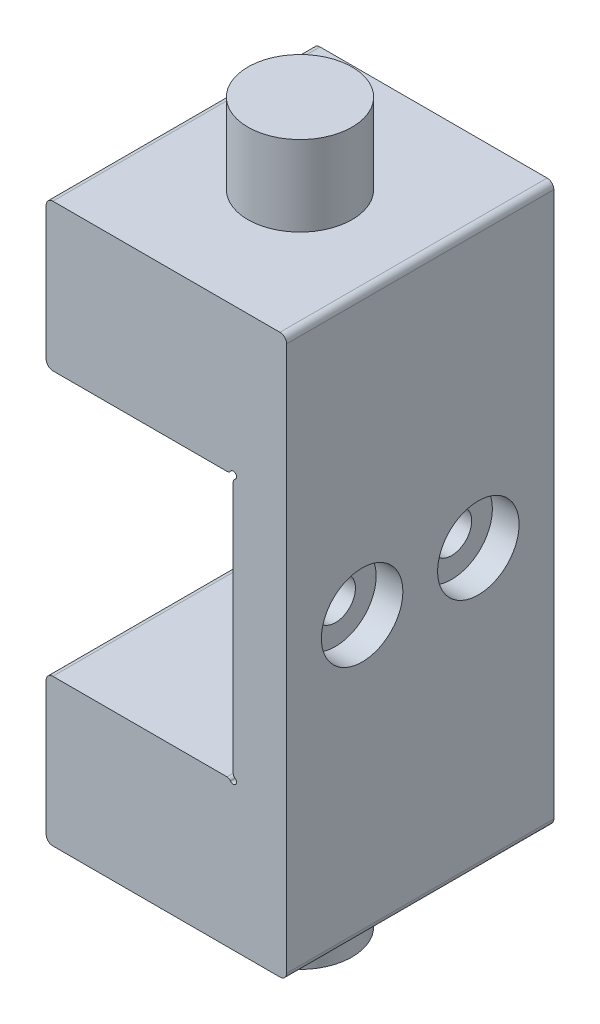
ISO-10303-21;
HEADER;
FILE_DESCRIPTION(('STEP AP214'),'2;1');
FILE_NAME('part.step','',(''),(''),'','','');
FILE_SCHEMA(('AUTOMOTIVE_DESIGN { 1 0 10303 214 1 1 1 1 }'));
ENDSEC;
DATA;
#1=APPLICATION_CONTEXT('core data for automotive mechanical design processes');
#2=APPLICATION_PROTOCOL_DEFINITION('international standard','automotive_design',2000,#1);
#3=PRODUCT_CONTEXT('',#1,'mechanical');
#4=PRODUCT('Part','Part','',(#3));
#5=PRODUCT_RELATED_PRODUCT_CATEGORY('part','',(#4));
#6=PRODUCT_DEFINITION_FORMATION('','',#4);
#7=PRODUCT_DEFINITION_CONTEXT('part definition',#1,'design');
#8=PRODUCT_DEFINITION('design','',#6,#7);
#9=PRODUCT_DEFINITION_SHAPE('','',#8);
#10=(LENGTH_UNIT() NAMED_UNIT(*) SI_UNIT(.MILLI.,.METRE.));
#11=(NAMED_UNIT(*) PLANE_ANGLE_UNIT() SI_UNIT($,.RADIAN.));
#12=(NAMED_UNIT(*) SI_UNIT($,.STERADIAN.) SOLID_ANGLE_UNIT());
#13=UNCERTAINTY_MEASURE_WITH_UNIT(LENGTH_MEASURE(1.E-05),#10,'distance_accuracy_value','');
#14=(GEOMETRIC_REPRESENTATION_CONTEXT(3) GLOBAL_UNCERTAINTY_ASSIGNED_CONTEXT((#13)) GLOBAL_UNIT_ASSIGNED_CONTEXT((#10,
#11,#12)) REPRESENTATION_CONTEXT('',''));
#15=CARTESIAN_POINT('',(0.,0.,0.));
#16=DIRECTION('',(0.,0.,1.));
#17=DIRECTION('',(1.,0.,0.));
#18=AXIS2_PLACEMENT_3D('',#15,#16,#17);
#19=CARTESIAN_POINT('',(-14.001,9.9,14.35));
#20=DIRECTION('',(1.,0.,0.));
#21=DIRECTION('',(0.,1.,0.));
#22=AXIS2_PLACEMENT_3D('',#19,#20,#21);
#23=CYLINDRICAL_SURFACE('',#22,1.5);
#24=CARTESIAN_POINT('',(0.,9.9,14.35));
#25=DIRECTION('',(1.,0.,0.));
#26=DIRECTION('',(0.,1.,0.));
#27=AXIS2_PLACEMENT_3D('',#24,#25,#26);
#28=CIRCLE('',#27,1.5);
#29=CARTESIAN_POINT('',(0.,11.4,14.35));
#30=VERTEX_POINT('',#29);
#31=EDGE_CURVE('E311',#30,#30,#28,.F.);
#32=ORIENTED_EDGE('',*,*,#31,.T.);
#33=EDGE_LOOP('',(#32));
#34=FACE_BOUND('',#33,.T.);
#35=CARTESIAN_POINT('',(2.,9.9,14.35));
#36=DIRECTION('',(1.,0.,0.));
#37=DIRECTION('',(0.,1.,0.));
#38=AXIS2_PLACEMENT_3D('',#35,#36,#37);
#39=CIRCLE('',#38,1.5);
#40=CARTESIAN_POINT('',(2.,11.4,14.35));
#41=VERTEX_POINT('',#40);
#42=EDGE_CURVE('E36',#41,#41,#39,.F.);
#43=ORIENTED_EDGE('',*,*,#42,.F.);
#44=EDGE_LOOP('',(#43));
#45=FACE_BOUND('',#44,.T.);
#46=ADVANCED_FACE('F32',(#34,#45),#23,.F.);
#47=CARTESIAN_POINT('',(-14.001,9.9,5.65));
#48=DIRECTION('',(1.,0.,0.));
#49=DIRECTION('',(0.,1.,0.));
#50=AXIS2_PLACEMENT_3D('',#47,#48,#49);
#51=CYLINDRICAL_SURFACE('',#50,1.5);
#52=CARTESIAN_POINT('',(0.,9.9,5.65));
#53=DIRECTION('',(1.,0.,0.));
#54=DIRECTION('',(0.,1.,0.));
#55=AXIS2_PLACEMENT_3D('',#52,#53,#54);
#56=CIRCLE('',#55,1.5);
#57=CARTESIAN_POINT('',(0.,11.4,5.65));
#58=VERTEX_POINT('',#57);
#59=EDGE_CURVE('E314',#58,#58,#56,.F.);
#60=ORIENTED_EDGE('',*,*,#59,.T.);
#61=EDGE_LOOP('',(#60));
#62=FACE_BOUND('',#61,.T.);
#63=CARTESIAN_POINT('',(2.,9.9,5.65));
#64=DIRECTION('',(1.,0.,0.));
#65=DIRECTION('',(0.,1.,0.));
#66=AXIS2_PLACEMENT_3D('',#63,#64,#65);
#67=CIRCLE('',#66,1.5);
#68=CARTESIAN_POINT('',(2.,11.4,5.65));
#69=VERTEX_POINT('',#68);
#70=EDGE_CURVE('E283',#69,#69,#67,.F.);
#71=ORIENTED_EDGE('',*,*,#70,.F.);
#72=EDGE_LOOP('',(#71));
#73=FACE_BOUND('',#72,.T.);
#74=ADVANCED_FACE('F445',(#62,#73),#51,.F.);
#75=CARTESIAN_POINT('',(0.,19.8,20.));
#76=DIRECTION('',(1.,0.,0.));
#77=DIRECTION('',(0.,1.,0.));
#78=AXIS2_PLACEMENT_3D('',#75,#76,#77);
#79=PLANE('',#78);
#80=ORIENTED_EDGE('',*,*,#59,.F.);
#81=EDGE_LOOP('',(#80));
#82=FACE_BOUND('',#81,.T.);
#83=ORIENTED_EDGE('',*,*,#31,.F.);
#84=EDGE_LOOP('',(#83));
#85=FACE_BOUND('',#84,.T.);
#86=DIRECTION('',(0.,-1.,0.));
#87=VECTOR('',#86,1.);
#88=CARTESIAN_POINT('',(0.,19.8,0.));
#89=LINE('',#88,#87);
#90=CARTESIAN_POINT('',(0.,19.3390227771354,0.));
#91=VERTEX_POINT('',#90);
#92=CARTESIAN_POINT('',(0.,0.460977222864652,0.));
#93=VERTEX_POINT('',#92);
#94=EDGE_CURVE('E196',#91,#93,#89,.T.);
#95=ORIENTED_EDGE('',*,*,#94,.T.);
#96=DIRECTION('',(0.,0.,1.));
#97=VECTOR('',#96,1.);
#98=CARTESIAN_POINT('',(0.,0.460977222864645,20.));
#99=LINE('',#98,#97);
#100=CARTESIAN_POINT('',(0.,0.460977222864652,20.));
#101=VERTEX_POINT('',#100);
#102=EDGE_CURVE('E222',#93,#101,#99,.T.);
#103=ORIENTED_EDGE('',*,*,#102,.T.);
#104=DIRECTION('',(0.,-1.,0.));
#105=VECTOR('',#104,1.);
#106=CARTESIAN_POINT('',(0.,19.8,20.));
#107=LINE('',#106,#105);
#108=CARTESIAN_POINT('',(0.,19.3390227771354,20.));
#109=VERTEX_POINT('',#108);
#110=EDGE_CURVE('E326',#109,#101,#107,.T.);
#111=ORIENTED_EDGE('',*,*,#110,.F.);
#112=DIRECTION('',(0.,0.,1.));
#113=VECTOR('',#112,1.);
#114=CARTESIAN_POINT('',(0.,19.3390227771354,20.));
#115=LINE('',#114,#113);
#116=EDGE_CURVE('E184',#109,#91,#115,.F.);
#117=ORIENTED_EDGE('',*,*,#116,.T.);
#118=EDGE_LOOP('',(#95,#103,#111,#117));
#119=FACE_BOUND('',#118,.T.);
#120=ADVANCED_FACE('F385',(#82,#85,#119),#79,.F.);
#121=CARTESIAN_POINT('',(0.,0.,20.));
#122=DIRECTION('',(0.,-1.,0.));
#123=DIRECTION('',(1.,0.,0.));
#124=AXIS2_PLACEMENT_3D('',#121,#122,#123);
#125=PLANE('',#124);
#126=DIRECTION('',(-1.,0.,0.));
#127=VECTOR('',#126,1.);
#128=CARTESIAN_POINT('',(0.,0.,0.));
#129=LINE('',#128,#127);
#130=CARTESIAN_POINT('',(-0.460977222864644,0.,0.));
#131=VERTEX_POINT('',#130);
#132=CARTESIAN_POINT('',(-13.5,0.,0.));
#133=VERTEX_POINT('',#132);
#134=EDGE_CURVE('E180',#131,#133,#129,.T.);
#135=ORIENTED_EDGE('',*,*,#134,.T.);
#136=DIRECTION('',(0.,0.,-1.));
#137=VECTOR('',#136,1.);
#138=CARTESIAN_POINT('',(-13.5,0.,20.));
#139=LINE('',#138,#137);
#140=CARTESIAN_POINT('',(-13.5,0.,20.));
#141=VERTEX_POINT('',#140);
#142=EDGE_CURVE('E273',#133,#141,#139,.F.);
#143=ORIENTED_EDGE('',*,*,#142,.T.);
#144=DIRECTION('',(-1.,0.,0.));
#145=VECTOR('',#144,1.);
#146=CARTESIAN_POINT('',(0.,0.,20.));
#147=LINE('',#146,#145);
#148=CARTESIAN_POINT('',(-0.460977222864644,0.,20.));
#149=VERTEX_POINT('',#148);
#150=EDGE_CURVE('E329',#149,#141,#147,.T.);
#151=ORIENTED_EDGE('',*,*,#150,.F.);
#152=DIRECTION('',(0.,0.,1.));
#153=VECTOR('',#152,1.);
#154=CARTESIAN_POINT('',(-0.460977222864644,0.,20.));
#155=LINE('',#154,#153);
#156=EDGE_CURVE('E213',#149,#131,#155,.F.);
#157=ORIENTED_EDGE('',*,*,#156,.T.);
#158=EDGE_LOOP('',(#135,#143,#151,#157));
#159=FACE_BOUND('',#158,.T.);
#160=ADVANCED_FACE('F393',(#159),#125,.F.);
#161=CARTESIAN_POINT('',(-14.,0.,20.));
#162=DIRECTION('',(1.,0.,0.));
#163=DIRECTION('',(0.,1.,0.));
#164=AXIS2_PLACEMENT_3D('',#161,#162,#163);
#165=PLANE('',#164);
#166=DIRECTION('',(0.,-1.,0.));
#167=VECTOR('',#166,1.);
#168=CARTESIAN_POINT('',(-14.,0.,20.));
#169=LINE('',#168,#167);
#170=CARTESIAN_POINT('',(-14.,-0.500000000000002,20.));
#171=VERTEX_POINT('',#170);
#172=CARTESIAN_POINT('',(-14.,-10.5,20.));
#173=VERTEX_POINT('',#172);
#174=EDGE_CURVE('E333',#171,#173,#169,.T.);
#175=ORIENTED_EDGE('',*,*,#174,.F.);
#176=DIRECTION('',(0.,0.,-1.));
#177=VECTOR('',#176,1.);
#178=CARTESIAN_POINT('',(-14.,-0.500000000000002,20.));
#179=LINE('',#178,#177);
#180=CARTESIAN_POINT('',(-14.,-0.500000000000002,0.));
#181=VERTEX_POINT('',#180);
#182=EDGE_CURVE('E270',#171,#181,#179,.T.);
#183=ORIENTED_EDGE('',*,*,#182,.T.);
#184=DIRECTION('',(0.,-1.,0.));
#185=VECTOR('',#184,1.);
#186=CARTESIAN_POINT('',(-14.,0.,0.));
#187=LINE('',#186,#185);
#188=CARTESIAN_POINT('',(-14.,-10.5,0.));
#189=VERTEX_POINT('',#188);
#190=EDGE_CURVE('E350',#181,#189,#187,.T.);
#191=ORIENTED_EDGE('',*,*,#190,.T.);
#192=DIRECTION('',(0.,0.,-1.));
#193=VECTOR('',#192,1.);
#194=CARTESIAN_POINT('',(-14.,-10.5,20.));
#195=LINE('',#194,#193);
#196=EDGE_CURVE('E268',#189,#173,#195,.F.);
#197=ORIENTED_EDGE('',*,*,#196,.T.);
#198=EDGE_LOOP('',(#175,#183,#191,#197));
#199=FACE_BOUND('',#198,.T.);
#200=ADVANCED_FACE('F401',(#199),#165,.F.);
#201=CARTESIAN_POINT('',(-14.,-11.,20.));
#202=DIRECTION('',(0.,1.,0.));
#203=DIRECTION('',(0.,0.,1.));
#204=AXIS2_PLACEMENT_3D('',#201,#202,#203);
#205=PLANE('',#204);
#206=CARTESIAN_POINT('',(-5.,-11.,10.));
#207=DIRECTION('',(0.,-1.,0.));
#208=DIRECTION('',(0.,0.,-1.));
#209=AXIS2_PLACEMENT_3D('',#206,#207,#208);
#210=CIRCLE('',#209,3.9);
#211=CARTESIAN_POINT('',(-5.,-11.,6.1));
#212=VERTEX_POINT('',#211);
#213=EDGE_CURVE('E233',#212,#212,#210,.T.);
#214=ORIENTED_EDGE('',*,*,#213,.F.);
#215=EDGE_LOOP('',(#214));
#216=FACE_BOUND('',#215,.T.);
#217=DIRECTION('',(1.,0.,0.));
#218=VECTOR('',#217,1.);
#219=CARTESIAN_POINT('',(-14.,-11.,0.));
#220=LINE('',#219,#218);
#221=CARTESIAN_POINT('',(-13.5,-11.,0.));
#222=VERTEX_POINT('',#221);
#223=CARTESIAN_POINT('',(3.5,-11.,0.));
#224=VERTEX_POINT('',#223);
#225=EDGE_CURVE('E353',#222,#224,#220,.T.);
#226=ORIENTED_EDGE('',*,*,#225,.T.);
#227=DIRECTION('',(0.,0.,-1.));
#228=VECTOR('',#227,1.);
#229=CARTESIAN_POINT('',(3.5,-11.,20.));
#230=LINE('',#229,#228);
#231=CARTESIAN_POINT('',(3.5,-11.,20.));
#232=VERTEX_POINT('',#231);
#233=EDGE_CURVE('E11',#224,#232,#230,.F.);
#234=ORIENTED_EDGE('',*,*,#233,.T.);
#235=DIRECTION('',(1.,0.,0.));
#236=VECTOR('',#235,1.);
#237=CARTESIAN_POINT('',(-14.,-11.,20.));
#238=LINE('',#237,#236);
#239=CARTESIAN_POINT('',(-13.5,-11.,20.));
#240=VERTEX_POINT('',#239);
#241=EDGE_CURVE('E336',#240,#232,#238,.T.);
#242=ORIENTED_EDGE('',*,*,#241,.F.);
#243=DIRECTION('',(0.,0.,-1.));
#244=VECTOR('',#243,1.);
#245=CARTESIAN_POINT('',(-13.5,-11.,20.));
#246=LINE('',#245,#244);
#247=EDGE_CURVE('E41',#240,#222,#246,.T.);
#248=ORIENTED_EDGE('',*,*,#247,.T.);
#249=EDGE_LOOP('',(#226,#234,#242,#248));
#250=FACE_BOUND('',#249,.T.);
#251=ADVANCED_FACE('F409',(#216,#250),#205,.F.);
#252=CARTESIAN_POINT('',(4.,-11.,20.));
#253=DIRECTION('',(-1.,0.,0.));
#254=DIRECTION('',(0.,-1.,0.));
#255=AXIS2_PLACEMENT_3D('',#252,#253,#254);
#256=PLANE('',#255);
#257=CARTESIAN_POINT('',(4.,9.9,14.35));
#258=DIRECTION('',(1.,0.,0.));
#259=DIRECTION('',(0.,1.,0.));
#260=AXIS2_PLACEMENT_3D('',#257,#258,#259);
#261=CIRCLE('',#260,3.05);
#262=CARTESIAN_POINT('',(4.,12.95,14.35));
#263=VERTEX_POINT('',#262);
#264=EDGE_CURVE('E291',#263,#263,#261,.T.);
#265=ORIENTED_EDGE('',*,*,#264,.F.);
#266=EDGE_LOOP('',(#265));
#267=FACE_BOUND('',#266,.T.);
#268=CARTESIAN_POINT('',(4.,9.9,5.65));
#269=DIRECTION('',(1.,0.,0.));
#270=DIRECTION('',(0.,1.,0.));
#271=AXIS2_PLACEMENT_3D('',#268,#269,#270);
#272=CIRCLE('',#271,3.05);
#273=CARTESIAN_POINT('',(4.,12.95,5.65));
#274=VERTEX_POINT('',#273);
#275=EDGE_CURVE('E301',#274,#274,#272,.T.);
#276=ORIENTED_EDGE('',*,*,#275,.F.);
#277=EDGE_LOOP('',(#276));
#278=FACE_BOUND('',#277,.T.);
#279=DIRECTION('',(0.,1.,0.));
#280=VECTOR('',#279,1.);
#281=CARTESIAN_POINT('',(4.,-11.,0.));
#282=LINE('',#281,#280);
#283=CARTESIAN_POINT('',(4.,-10.5,0.));
#284=VERTEX_POINT('',#283);
#285=CARTESIAN_POINT('',(4.,30.3,0.));
#286=VERTEX_POINT('',#285);
#287=EDGE_CURVE('E356',#284,#286,#282,.T.);
#288=ORIENTED_EDGE('',*,*,#287,.T.);
#289=DIRECTION('',(0.,0.,-1.));
#290=VECTOR('',#289,1.);
#291=CARTESIAN_POINT('',(4.,30.3,20.));
#292=LINE('',#291,#290);
#293=CARTESIAN_POINT('',(4.,30.3,20.));
#294=VERTEX_POINT('',#293);
#295=EDGE_CURVE('E57',#286,#294,#292,.F.);
#296=ORIENTED_EDGE('',*,*,#295,.T.);
#297=DIRECTION('',(0.,1.,0.));
#298=VECTOR('',#297,1.);
#299=CARTESIAN_POINT('',(4.,-11.,20.));
#300=LINE('',#299,#298);
#301=CARTESIAN_POINT('',(4.,-10.5,20.));
#302=VERTEX_POINT('',#301);
#303=EDGE_CURVE('E339',#302,#294,#300,.T.);
#304=ORIENTED_EDGE('',*,*,#303,.F.);
#305=DIRECTION('',(0.,0.,-1.));
#306=VECTOR('',#305,1.);
#307=CARTESIAN_POINT('',(4.,-10.5,20.));
#308=LINE('',#307,#306);
#309=EDGE_CURVE('E278',#302,#284,#308,.T.);
#310=ORIENTED_EDGE('',*,*,#309,.T.);
#311=EDGE_LOOP('',(#288,#296,#304,#310));
#312=FACE_BOUND('',#311,.T.);
#313=ADVANCED_FACE('F416',(#267,#278,#312),#256,.F.);
#314=CARTESIAN_POINT('',(-14.,30.8,20.));
#315=DIRECTION('',(0.,-1.,0.));
#316=DIRECTION('',(0.,0.,-1.));
#317=AXIS2_PLACEMENT_3D('',#314,#315,#316);
#318=PLANE('',#317);
#319=CARTESIAN_POINT('',(-5.,30.8,10.));
#320=DIRECTION('',(0.,1.,0.));
#321=DIRECTION('',(0.,0.,1.));
#322=AXIS2_PLACEMENT_3D('',#319,#320,#321);
#323=CIRCLE('',#322,3.9);
#324=CARTESIAN_POINT('',(-5.,30.8,13.9));
#325=VERTEX_POINT('',#324);
#326=EDGE_CURVE('E237',#325,#325,#323,.T.);
#327=ORIENTED_EDGE('',*,*,#326,.F.);
#328=EDGE_LOOP('',(#327));
#329=FACE_BOUND('',#328,.T.);
#330=DIRECTION('',(-1.,0.,0.));
#331=VECTOR('',#330,1.);
#332=CARTESIAN_POINT('',(-14.,30.8,0.));
#333=LINE('',#332,#331);
#334=CARTESIAN_POINT('',(3.5,30.8,0.));
#335=VERTEX_POINT('',#334);
#336=CARTESIAN_POINT('',(-13.5,30.8,0.));
#337=VERTEX_POINT('',#336);
#338=EDGE_CURVE('E358',#335,#337,#333,.T.);
#339=ORIENTED_EDGE('',*,*,#338,.T.);
#340=DIRECTION('',(0.,0.,-1.));
#341=VECTOR('',#340,1.);
#342=CARTESIAN_POINT('',(-13.5,30.8,20.));
#343=LINE('',#342,#341);
#344=CARTESIAN_POINT('',(-13.5,30.8,20.));
#345=VERTEX_POINT('',#344);
#346=EDGE_CURVE('E255',#337,#345,#343,.F.);
#347=ORIENTED_EDGE('',*,*,#346,.T.);
#348=DIRECTION('',(-1.,0.,0.));
#349=VECTOR('',#348,1.);
#350=CARTESIAN_POINT('',(-14.,30.8,20.));
#351=LINE('',#350,#349);
#352=CARTESIAN_POINT('',(3.5,30.8,20.));
#353=VERTEX_POINT('',#352);
#354=EDGE_CURVE('E341',#353,#345,#351,.T.);
#355=ORIENTED_EDGE('',*,*,#354,.F.);
#356=DIRECTION('',(0.,0.,-1.));
#357=VECTOR('',#356,1.);
#358=CARTESIAN_POINT('',(3.5,30.8,20.));
#359=LINE('',#358,#357);
#360=EDGE_CURVE('E252',#353,#335,#359,.T.);
#361=ORIENTED_EDGE('',*,*,#360,.T.);
#362=EDGE_LOOP('',(#339,#347,#355,#361));
#363=FACE_BOUND('',#362,.T.);
#364=ADVANCED_FACE('F424',(#329,#363),#318,.F.);
#365=CARTESIAN_POINT('',(-14.,30.8,20.));
#366=DIRECTION('',(1.,0.,0.));
#367=DIRECTION('',(0.,1.,0.));
#368=AXIS2_PLACEMENT_3D('',#365,#366,#367);
#369=PLANE('',#368);
#370=DIRECTION('',(0.,-1.,0.));
#371=VECTOR('',#370,1.);
#372=CARTESIAN_POINT('',(-14.,30.8,20.));
#373=LINE('',#372,#371);
#374=CARTESIAN_POINT('',(-14.,30.3,20.));
#375=VERTEX_POINT('',#374);
#376=CARTESIAN_POINT('',(-14.,20.3,20.));
#377=VERTEX_POINT('',#376);
#378=EDGE_CURVE('E344',#375,#377,#373,.T.);
#379=ORIENTED_EDGE('',*,*,#378,.F.);
#380=DIRECTION('',(0.,0.,-1.));
#381=VECTOR('',#380,1.);
#382=CARTESIAN_POINT('',(-14.,30.3,20.));
#383=LINE('',#382,#381);
#384=CARTESIAN_POINT('',(-14.,30.3,0.));
#385=VERTEX_POINT('',#384);
#386=EDGE_CURVE('E236',#375,#385,#383,.T.);
#387=ORIENTED_EDGE('',*,*,#386,.T.);
#388=DIRECTION('',(0.,-1.,0.));
#389=VECTOR('',#388,1.);
#390=CARTESIAN_POINT('',(-14.,30.8,0.));
#391=LINE('',#390,#389);
#392=CARTESIAN_POINT('',(-14.,20.3,0.));
#393=VERTEX_POINT('',#392);
#394=EDGE_CURVE('E361',#385,#393,#391,.T.);
#395=ORIENTED_EDGE('',*,*,#394,.T.);
#396=DIRECTION('',(0.,0.,-1.));
#397=VECTOR('',#396,1.);
#398=CARTESIAN_POINT('',(-14.,20.3,20.));
#399=LINE('',#398,#397);
#400=EDGE_CURVE('E234',#393,#377,#399,.F.);
#401=ORIENTED_EDGE('',*,*,#400,.T.);
#402=EDGE_LOOP('',(#379,#387,#395,#401));
#403=FACE_BOUND('',#402,.T.);
#404=ADVANCED_FACE('F432',(#403),#369,.F.);
#405=CARTESIAN_POINT('',(-14.,19.8,20.));
#406=DIRECTION('',(0.,1.,0.));
#407=DIRECTION('',(0.,0.,1.));
#408=AXIS2_PLACEMENT_3D('',#405,#406,#407);
#409=PLANE('',#408);
#410=DIRECTION('',(1.,0.,0.));
#411=VECTOR('',#410,1.);
#412=CARTESIAN_POINT('',(-14.,19.8,20.));
#413=LINE('',#412,#411);
#414=CARTESIAN_POINT('',(-13.5,19.8,20.));
#415=VERTEX_POINT('',#414);
#416=CARTESIAN_POINT('',(-0.460977222864645,19.8,20.));
#417=VERTEX_POINT('',#416);
#418=EDGE_CURVE('E205',#415,#417,#413,.T.);
#419=ORIENTED_EDGE('',*,*,#418,.F.);
#420=DIRECTION('',(0.,0.,-1.));
#421=VECTOR('',#420,1.);
#422=CARTESIAN_POINT('',(-13.5,19.8,20.));
#423=LINE('',#422,#421);
#424=CARTESIAN_POINT('',(-13.5,19.8,0.));
#425=VERTEX_POINT('',#424);
#426=EDGE_CURVE('E275',#415,#425,#423,.T.);
#427=ORIENTED_EDGE('',*,*,#426,.T.);
#428=DIRECTION('',(1.,0.,0.));
#429=VECTOR('',#428,1.);
#430=CARTESIAN_POINT('',(-14.,19.8,0.));
#431=LINE('',#430,#429);
#432=CARTESIAN_POINT('',(-0.460977222864645,19.8,0.));
#433=VERTEX_POINT('',#432);
#434=EDGE_CURVE('E330',#425,#433,#431,.T.);
#435=ORIENTED_EDGE('',*,*,#434,.T.);
#436=DIRECTION('',(0.,0.,1.));
#437=VECTOR('',#436,1.);
#438=CARTESIAN_POINT('',(-0.460977222864645,19.8,20.));
#439=LINE('',#438,#437);
#440=EDGE_CURVE('E230',#433,#417,#439,.T.);
#441=ORIENTED_EDGE('',*,*,#440,.T.);
#442=EDGE_LOOP('',(#419,#427,#435,#441));
#443=FACE_BOUND('',#442,.T.);
#444=ADVANCED_FACE('F365',(#443),#409,.F.);
#445=CARTESIAN_POINT('',(0.,0.,20.));
#446=DIRECTION('',(0.,0.,-1.));
#447=DIRECTION('',(-1.,0.,0.));
#448=AXIS2_PLACEMENT_3D('',#445,#446,#447);
#449=PLANE('',#448);
#450=ORIENTED_EDGE('',*,*,#354,.T.);
#451=CARTESIAN_POINT('',(-13.5,30.3,20.));
#452=DIRECTION('',(0.,0.,-1.));
#453=DIRECTION('',(-1.,0.,0.));
#454=AXIS2_PLACEMENT_3D('',#451,#452,#453);
#455=CIRCLE('',#454,0.5);
#456=EDGE_CURVE('E266',#345,#375,#455,.F.);
#457=ORIENTED_EDGE('',*,*,#456,.T.);
#458=ORIENTED_EDGE('',*,*,#378,.T.);
#459=CARTESIAN_POINT('',(-13.5,20.3,20.));
#460=DIRECTION('',(0.,0.,-1.));
#461=DIRECTION('',(-1.,0.,0.));
#462=AXIS2_PLACEMENT_3D('',#459,#460,#461);
#463=CIRCLE('',#462,0.5);
#464=EDGE_CURVE('E49',#377,#415,#463,.F.);
#465=ORIENTED_EDGE('',*,*,#464,.T.);
#466=ORIENTED_EDGE('',*,*,#418,.T.);
#467=CARTESIAN_POINT('',(-0.460977222864645,20.1,20.));
#468=DIRECTION('',(0.,0.,-1.));
#469=DIRECTION('',(-1.,0.,0.));
#470=AXIS2_PLACEMENT_3D('',#467,#468,#469);
#471=CIRCLE('',#470,0.3);
#472=CARTESIAN_POINT('',(-0.209535101302113,19.9363636363636,20.));
#473=VERTEX_POINT('',#472);
#474=EDGE_CURVE('E203',#417,#473,#471,.F.);
#475=ORIENTED_EDGE('',*,*,#474,.T.);
#476=CARTESIAN_POINT('',(0.,19.8,20.));
#477=DIRECTION('',(0.,0.,1.));
#478=DIRECTION('',(1.,0.,0.));
#479=AXIS2_PLACEMENT_3D('',#476,#477,#478);
#480=CIRCLE('',#479,0.25);
#481=CARTESIAN_POINT('',(0.136363636363634,19.5904648986979,20.));
#482=VERTEX_POINT('',#481);
#483=EDGE_CURVE('E317',#482,#473,#480,.T.);
#484=ORIENTED_EDGE('',*,*,#483,.F.);
#485=CARTESIAN_POINT('',(0.299999999999999,19.3390227771354,20.));
#486=DIRECTION('',(0.,0.,-1.));
#487=DIRECTION('',(-1.,0.,0.));
#488=AXIS2_PLACEMENT_3D('',#485,#486,#487);
#489=CIRCLE('',#488,0.3);
#490=EDGE_CURVE('E201',#482,#109,#489,.F.);
#491=ORIENTED_EDGE('',*,*,#490,.T.);
#492=ORIENTED_EDGE('',*,*,#110,.T.);
#493=CARTESIAN_POINT('',(0.3,0.460977222864644,20.));
#494=DIRECTION('',(0.,0.,-1.));
#495=DIRECTION('',(-1.,0.,0.));
#496=AXIS2_PLACEMENT_3D('',#493,#494,#495);
#497=CIRCLE('',#496,0.3);
#498=CARTESIAN_POINT('',(0.136363636363636,0.209535101302111,20.));
#499=VERTEX_POINT('',#498);
#500=EDGE_CURVE('E210',#101,#499,#497,.F.);
#501=ORIENTED_EDGE('',*,*,#500,.T.);
#502=CARTESIAN_POINT('',(0.,0.,20.));
#503=DIRECTION('',(0.,0.,1.));
#504=DIRECTION('',(1.,0.,0.));
#505=AXIS2_PLACEMENT_3D('',#502,#503,#504);
#506=CIRCLE('',#505,0.25);
#507=CARTESIAN_POINT('',(-0.209535101302111,-0.136363636363636,20.));
#508=VERTEX_POINT('',#507);
#509=EDGE_CURVE('E197',#508,#499,#506,.T.);
#510=ORIENTED_EDGE('',*,*,#509,.F.);
#511=CARTESIAN_POINT('',(-0.460977222864644,-0.3,20.));
#512=DIRECTION('',(0.,0.,-1.));
#513=DIRECTION('',(-1.,0.,0.));
#514=AXIS2_PLACEMENT_3D('',#511,#512,#513);
#515=CIRCLE('',#514,0.3);
#516=EDGE_CURVE('E200',#508,#149,#515,.F.);
#517=ORIENTED_EDGE('',*,*,#516,.T.);
#518=ORIENTED_EDGE('',*,*,#150,.T.);
#519=CARTESIAN_POINT('',(-13.5,-0.500000000000002,20.));
#520=DIRECTION('',(0.,0.,-1.));
#521=DIRECTION('',(-1.,0.,0.));
#522=AXIS2_PLACEMENT_3D('',#519,#520,#521);
#523=CIRCLE('',#522,0.5);
#524=EDGE_CURVE('E264',#141,#171,#523,.F.);
#525=ORIENTED_EDGE('',*,*,#524,.T.);
#526=ORIENTED_EDGE('',*,*,#174,.T.);
#527=CARTESIAN_POINT('',(-13.5,-10.5,20.));
#528=DIRECTION('',(0.,0.,-1.));
#529=DIRECTION('',(-1.,0.,0.));
#530=AXIS2_PLACEMENT_3D('',#527,#528,#529);
#531=CIRCLE('',#530,0.5);
#532=EDGE_CURVE('E257',#173,#240,#531,.F.);
#533=ORIENTED_EDGE('',*,*,#532,.T.);
#534=ORIENTED_EDGE('',*,*,#241,.T.);
#535=CARTESIAN_POINT('',(3.5,-10.5,20.));
#536=DIRECTION('',(0.,0.,-1.));
#537=DIRECTION('',(-1.,0.,0.));
#538=AXIS2_PLACEMENT_3D('',#535,#536,#537);
#539=CIRCLE('',#538,0.5);
#540=EDGE_CURVE('E259',#232,#302,#539,.F.);
#541=ORIENTED_EDGE('',*,*,#540,.T.);
#542=ORIENTED_EDGE('',*,*,#303,.T.);
#543=CARTESIAN_POINT('',(3.5,30.3,20.));
#544=DIRECTION('',(0.,0.,-1.));
#545=DIRECTION('',(-1.,0.,0.));
#546=AXIS2_PLACEMENT_3D('',#543,#544,#545);
#547=CIRCLE('',#546,0.5);
#548=EDGE_CURVE('E261',#294,#353,#547,.F.);
#549=ORIENTED_EDGE('',*,*,#548,.T.);
#550=EDGE_LOOP('',(#450,#457,#458,#465,#466,#475,#484,#491,#492,#501,#510,#517,#518,#525,#526,
#533,#534,#541,#542,#549));
#551=FACE_BOUND('',#550,.T.);
#552=ADVANCED_FACE('F374',(#551),#449,.F.);
#553=CARTESIAN_POINT('',(0.,0.,0.));
#554=DIRECTION('',(0.,0.,-1.));
#555=DIRECTION('',(-1.,0.,0.));
#556=AXIS2_PLACEMENT_3D('',#553,#554,#555);
#557=PLANE('',#556);
#558=ORIENTED_EDGE('',*,*,#394,.F.);
#559=CARTESIAN_POINT('',(-13.5,30.3,0.));
#560=DIRECTION('',(0.,0.,-1.));
#561=DIRECTION('',(-1.,0.,0.));
#562=AXIS2_PLACEMENT_3D('',#559,#560,#561);
#563=CIRCLE('',#562,0.5);
#564=EDGE_CURVE('E250',#385,#337,#563,.T.);
#565=ORIENTED_EDGE('',*,*,#564,.T.);
#566=ORIENTED_EDGE('',*,*,#338,.F.);
#567=CARTESIAN_POINT('',(3.5,30.3,0.));
#568=DIRECTION('',(0.,0.,-1.));
#569=DIRECTION('',(-1.,0.,0.));
#570=AXIS2_PLACEMENT_3D('',#567,#568,#569);
#571=CIRCLE('',#570,0.5);
#572=EDGE_CURVE('E244',#335,#286,#571,.T.);
#573=ORIENTED_EDGE('',*,*,#572,.T.);
#574=ORIENTED_EDGE('',*,*,#287,.F.);
#575=CARTESIAN_POINT('',(3.5,-10.5,0.));
#576=DIRECTION('',(0.,0.,-1.));
#577=DIRECTION('',(-1.,0.,0.));
#578=AXIS2_PLACEMENT_3D('',#575,#576,#577);
#579=CIRCLE('',#578,0.5);
#580=EDGE_CURVE('E242',#284,#224,#579,.T.);
#581=ORIENTED_EDGE('',*,*,#580,.T.);
#582=ORIENTED_EDGE('',*,*,#225,.F.);
#583=CARTESIAN_POINT('',(-13.5,-10.5,0.));
#584=DIRECTION('',(0.,0.,-1.));
#585=DIRECTION('',(-1.,0.,0.));
#586=AXIS2_PLACEMENT_3D('',#583,#584,#585);
#587=CIRCLE('',#586,0.5);
#588=EDGE_CURVE('E240',#222,#189,#587,.T.);
#589=ORIENTED_EDGE('',*,*,#588,.T.);
#590=ORIENTED_EDGE('',*,*,#190,.F.);
#591=CARTESIAN_POINT('',(-13.5,-0.500000000000002,0.));
#592=DIRECTION('',(0.,0.,-1.));
#593=DIRECTION('',(-1.,0.,0.));
#594=AXIS2_PLACEMENT_3D('',#591,#592,#593);
#595=CIRCLE('',#594,0.5);
#596=EDGE_CURVE('E248',#181,#133,#595,.T.);
#597=ORIENTED_EDGE('',*,*,#596,.T.);
#598=ORIENTED_EDGE('',*,*,#134,.F.);
#599=CARTESIAN_POINT('',(-0.460977222864644,-0.3,0.));
#600=DIRECTION('',(0.,0.,-1.));
#601=DIRECTION('',(-1.,0.,0.));
#602=AXIS2_PLACEMENT_3D('',#599,#600,#601);
#603=CIRCLE('',#602,0.3);
#604=CARTESIAN_POINT('',(-0.209535101302111,-0.136363636363636,0.));
#605=VERTEX_POINT('',#604);
#606=EDGE_CURVE('E174',#131,#605,#603,.T.);
#607=ORIENTED_EDGE('',*,*,#606,.T.);
#608=CARTESIAN_POINT('',(0.,0.,0.));
#609=DIRECTION('',(0.,0.,-1.));
#610=DIRECTION('',(-1.,0.,0.));
#611=AXIS2_PLACEMENT_3D('',#608,#609,#610);
#612=CIRCLE('',#611,0.25);
#613=CARTESIAN_POINT('',(0.136363636363636,0.209535101302111,0.));
#614=VERTEX_POINT('',#613);
#615=EDGE_CURVE('E178',#605,#614,#612,.F.);
#616=ORIENTED_EDGE('',*,*,#615,.T.);
#617=CARTESIAN_POINT('',(0.3,0.460977222864644,0.));
#618=DIRECTION('',(0.,0.,-1.));
#619=DIRECTION('',(-1.,0.,0.));
#620=AXIS2_PLACEMENT_3D('',#617,#618,#619);
#621=CIRCLE('',#620,0.3);
#622=EDGE_CURVE('E185',#614,#93,#621,.T.);
#623=ORIENTED_EDGE('',*,*,#622,.T.);
#624=ORIENTED_EDGE('',*,*,#94,.F.);
#625=CARTESIAN_POINT('',(0.299999999999999,19.3390227771354,0.));
#626=DIRECTION('',(0.,0.,-1.));
#627=DIRECTION('',(-1.,0.,0.));
#628=AXIS2_PLACEMENT_3D('',#625,#626,#627);
#629=CIRCLE('',#628,0.3);
#630=CARTESIAN_POINT('',(0.136363636363634,19.5904648986979,0.));
#631=VERTEX_POINT('',#630);
#632=EDGE_CURVE('E215',#91,#631,#629,.T.);
#633=ORIENTED_EDGE('',*,*,#632,.T.);
#634=CARTESIAN_POINT('',(0.,19.8,0.));
#635=DIRECTION('',(0.,0.,-1.));
#636=DIRECTION('',(-1.,0.,0.));
#637=AXIS2_PLACEMENT_3D('',#634,#635,#636);
#638=CIRCLE('',#637,0.25);
#639=CARTESIAN_POINT('',(-0.209535101302113,19.9363636363636,0.));
#640=VERTEX_POINT('',#639);
#641=EDGE_CURVE('E320',#631,#640,#638,.F.);
#642=ORIENTED_EDGE('',*,*,#641,.T.);
#643=CARTESIAN_POINT('',(-0.460977222864645,20.1,0.));
#644=DIRECTION('',(0.,0.,-1.));
#645=DIRECTION('',(-1.,0.,0.));
#646=AXIS2_PLACEMENT_3D('',#643,#644,#645);
#647=CIRCLE('',#646,0.3);
#648=EDGE_CURVE('E217',#640,#433,#647,.T.);
#649=ORIENTED_EDGE('',*,*,#648,.T.);
#650=ORIENTED_EDGE('',*,*,#434,.F.);
#651=CARTESIAN_POINT('',(-13.5,20.3,0.));
#652=DIRECTION('',(0.,0.,-1.));
#653=DIRECTION('',(-1.,0.,0.));
#654=AXIS2_PLACEMENT_3D('',#651,#652,#653);
#655=CIRCLE('',#654,0.5);
#656=EDGE_CURVE('E246',#425,#393,#655,.T.);
#657=ORIENTED_EDGE('',*,*,#656,.T.);
#658=EDGE_LOOP('',(#558,#565,#566,#573,#574,#581,#582,#589,#590,#597,#598,#607,#616,#623,#624,
#633,#642,#649,#650,#657));
#659=FACE_BOUND('',#658,.T.);
#660=ADVANCED_FACE('F177',(#659),#557,.T.);
#661=CARTESIAN_POINT('',(0.,19.8,-0.001000000000001));
#662=DIRECTION('',(0.,0.,1.));
#663=DIRECTION('',(1.,0.,0.));
#664=AXIS2_PLACEMENT_3D('',#661,#662,#663);
#665=CYLINDRICAL_SURFACE('',#664,0.25);
#666=ORIENTED_EDGE('',*,*,#483,.T.);
#667=DIRECTION('',(0.,0.,1.));
#668=VECTOR('',#667,1.);
#669=CARTESIAN_POINT('',(-0.209535101302113,19.9363636363636,-0.001000000000001));
#670=LINE('',#669,#668);
#671=EDGE_CURVE('E227',#473,#640,#670,.F.);
#672=ORIENTED_EDGE('',*,*,#671,.T.);
#673=ORIENTED_EDGE('',*,*,#641,.F.);
#674=DIRECTION('',(0.,0.,1.));
#675=VECTOR('',#674,1.);
#676=CARTESIAN_POINT('',(0.136363636363634,19.5904648986979,-0.001000000000001));
#677=LINE('',#676,#675);
#678=EDGE_CURVE('E224',#631,#482,#677,.T.);
#679=ORIENTED_EDGE('',*,*,#678,.T.);
#680=EDGE_LOOP('',(#666,#672,#673,#679));
#681=FACE_BOUND('',#680,.T.);
#682=ADVANCED_FACE('F376',(#681),#665,.F.);
#683=CARTESIAN_POINT('',(0.,0.,-0.001000000000001));
#684=DIRECTION('',(0.,0.,1.));
#685=DIRECTION('',(1.,0.,0.));
#686=AXIS2_PLACEMENT_3D('',#683,#684,#685);
#687=CYLINDRICAL_SURFACE('',#686,0.25);
#688=ORIENTED_EDGE('',*,*,#615,.F.);
#689=DIRECTION('',(0.,0.,1.));
#690=VECTOR('',#689,1.);
#691=CARTESIAN_POINT('',(-0.209535101302111,-0.136363636363636,-0.001000000000001));
#692=LINE('',#691,#690);
#693=EDGE_CURVE('E192',#605,#508,#692,.T.);
#694=ORIENTED_EDGE('',*,*,#693,.T.);
#695=ORIENTED_EDGE('',*,*,#509,.T.);
#696=DIRECTION('',(0.,0.,1.));
#697=VECTOR('',#696,1.);
#698=CARTESIAN_POINT('',(0.136363636363636,0.209535101302111,-0.001000000000001));
#699=LINE('',#698,#697);
#700=EDGE_CURVE('E195',#499,#614,#699,.F.);
#701=ORIENTED_EDGE('',*,*,#700,.T.);
#702=EDGE_LOOP('',(#688,#694,#695,#701));
#703=FACE_BOUND('',#702,.T.);
#704=ADVANCED_FACE('F190',(#703),#687,.F.);
#705=CARTESIAN_POINT('',(-0.460977222864644,-0.3,-0.001000000000001));
#706=DIRECTION('',(0.,0.,1.));
#707=DIRECTION('',(1.,0.,0.));
#708=AXIS2_PLACEMENT_3D('',#705,#706,#707);
#709=CYLINDRICAL_SURFACE('',#708,0.3);
#710=ORIENTED_EDGE('',*,*,#606,.F.);
#711=ORIENTED_EDGE('',*,*,#156,.F.);
#712=ORIENTED_EDGE('',*,*,#516,.F.);
#713=ORIENTED_EDGE('',*,*,#693,.F.);
#714=EDGE_LOOP('',(#710,#711,#712,#713));
#715=FACE_BOUND('',#714,.T.);
#716=ADVANCED_FACE('F199',(#715),#709,.T.);
#717=CARTESIAN_POINT('',(0.3,0.460977222864644,-0.001000000000001));
#718=DIRECTION('',(0.,0.,1.));
#719=DIRECTION('',(1.,0.,0.));
#720=AXIS2_PLACEMENT_3D('',#717,#718,#719);
#721=CYLINDRICAL_SURFACE('',#720,0.3);
#722=ORIENTED_EDGE('',*,*,#500,.F.);
#723=ORIENTED_EDGE('',*,*,#102,.F.);
#724=ORIENTED_EDGE('',*,*,#622,.F.);
#725=ORIENTED_EDGE('',*,*,#700,.F.);
#726=EDGE_LOOP('',(#722,#723,#724,#725));
#727=FACE_BOUND('',#726,.T.);
#728=ADVANCED_FACE('F389',(#727),#721,.T.);
#729=CARTESIAN_POINT('',(-0.460977222864645,20.1,-0.001000000000001));
#730=DIRECTION('',(0.,0.,1.));
#731=DIRECTION('',(1.,0.,0.));
#732=AXIS2_PLACEMENT_3D('',#729,#730,#731);
#733=CYLINDRICAL_SURFACE('',#732,0.3);
#734=ORIENTED_EDGE('',*,*,#474,.F.);
#735=ORIENTED_EDGE('',*,*,#440,.F.);
#736=ORIENTED_EDGE('',*,*,#648,.F.);
#737=ORIENTED_EDGE('',*,*,#671,.F.);
#738=EDGE_LOOP('',(#734,#735,#736,#737));
#739=FACE_BOUND('',#738,.T.);
#740=ADVANCED_FACE('F372',(#739),#733,.T.);
#741=CARTESIAN_POINT('',(0.299999999999999,19.3390227771354,-0.001000000000001));
#742=DIRECTION('',(0.,0.,1.));
#743=DIRECTION('',(1.,0.,0.));
#744=AXIS2_PLACEMENT_3D('',#741,#742,#743);
#745=CYLINDRICAL_SURFACE('',#744,0.3);
#746=ORIENTED_EDGE('',*,*,#632,.F.);
#747=ORIENTED_EDGE('',*,*,#116,.F.);
#748=ORIENTED_EDGE('',*,*,#490,.F.);
#749=ORIENTED_EDGE('',*,*,#678,.F.);
#750=EDGE_LOOP('',(#746,#747,#748,#749));
#751=FACE_BOUND('',#750,.T.);
#752=ADVANCED_FACE('F380',(#751),#745,.T.);
#753=CARTESIAN_POINT('',(-5.,-17.,10.));
#754=DIRECTION('',(0.,1.,0.));
#755=DIRECTION('',(0.,0.,1.));
#756=AXIS2_PLACEMENT_3D('',#753,#754,#755);
#757=CYLINDRICAL_SURFACE('',#756,3.9);
#758=CARTESIAN_POINT('',(-5.,-17.,10.));
#759=DIRECTION('',(0.,-1.,0.));
#760=DIRECTION('',(0.,0.,-1.));
#761=AXIS2_PLACEMENT_3D('',#758,#759,#760);
#762=CIRCLE('',#761,3.9);
#763=CARTESIAN_POINT('',(-5.,-17.,6.1));
#764=VERTEX_POINT('',#763);
#765=EDGE_CURVE('E306',#764,#764,#762,.T.);
#766=ORIENTED_EDGE('',*,*,#765,.F.);
#767=EDGE_LOOP('',(#766));
#768=FACE_BOUND('',#767,.T.);
#769=ORIENTED_EDGE('',*,*,#213,.T.);
#770=EDGE_LOOP('',(#769));
#771=FACE_BOUND('',#770,.T.);
#772=ADVANCED_FACE('F492',(#768,#771),#757,.T.);
#773=CARTESIAN_POINT('',(-5.,-17.,10.));
#774=DIRECTION('',(0.,-1.,0.));
#775=DIRECTION('',(0.,0.,-1.));
#776=AXIS2_PLACEMENT_3D('',#773,#774,#775);
#777=PLANE('',#776);
#778=ORIENTED_EDGE('',*,*,#765,.T.);
#779=EDGE_LOOP('',(#778));
#780=FACE_BOUND('',#779,.T.);
#781=ADVANCED_FACE('F504',(#780),#777,.T.);
#782=CARTESIAN_POINT('',(-5.,36.8,10.));
#783=DIRECTION('',(0.,-1.,0.));
#784=DIRECTION('',(0.,0.,-1.));
#785=AXIS2_PLACEMENT_3D('',#782,#783,#784);
#786=CYLINDRICAL_SURFACE('',#785,3.9);
#787=CARTESIAN_POINT('',(-5.,36.8,10.));
#788=DIRECTION('',(0.,1.,0.));
#789=DIRECTION('',(0.,0.,1.));
#790=AXIS2_PLACEMENT_3D('',#787,#788,#789);
#791=CIRCLE('',#790,3.9);
#792=CARTESIAN_POINT('',(-5.,36.8,13.9));
#793=VERTEX_POINT('',#792);
#794=EDGE_CURVE('E289',#793,#793,#791,.T.);
#795=ORIENTED_EDGE('',*,*,#794,.F.);
#796=EDGE_LOOP('',(#795));
#797=FACE_BOUND('',#796,.T.);
#798=ORIENTED_EDGE('',*,*,#326,.T.);
#799=EDGE_LOOP('',(#798));
#800=FACE_BOUND('',#799,.T.);
#801=ADVANCED_FACE('F498',(#797,#800),#786,.T.);
#802=CARTESIAN_POINT('',(-5.,36.8,10.));
#803=DIRECTION('',(0.,1.,0.));
#804=DIRECTION('',(0.,0.,1.));
#805=AXIS2_PLACEMENT_3D('',#802,#803,#804);
#806=PLANE('',#805);
#807=ORIENTED_EDGE('',*,*,#794,.T.);
#808=EDGE_LOOP('',(#807));
#809=FACE_BOUND('',#808,.T.);
#810=ADVANCED_FACE('F494',(#809),#806,.T.);
#811=CARTESIAN_POINT('',(-13.5,30.3,20.));
#812=DIRECTION('',(0.,0.,-1.));
#813=DIRECTION('',(-1.,0.,0.));
#814=AXIS2_PLACEMENT_3D('',#811,#812,#813);
#815=CYLINDRICAL_SURFACE('',#814,0.5);
#816=ORIENTED_EDGE('',*,*,#456,.F.);
#817=ORIENTED_EDGE('',*,*,#346,.F.);
#818=ORIENTED_EDGE('',*,*,#564,.F.);
#819=ORIENTED_EDGE('',*,*,#386,.F.);
#820=EDGE_LOOP('',(#816,#817,#818,#819));
#821=FACE_BOUND('',#820,.T.);
#822=ADVANCED_FACE('F430',(#821),#815,.T.);
#823=CARTESIAN_POINT('',(-13.5,-0.500000000000002,20.));
#824=DIRECTION('',(0.,0.,-1.));
#825=DIRECTION('',(-1.,0.,0.));
#826=AXIS2_PLACEMENT_3D('',#823,#824,#825);
#827=CYLINDRICAL_SURFACE('',#826,0.5);
#828=ORIENTED_EDGE('',*,*,#524,.F.);
#829=ORIENTED_EDGE('',*,*,#142,.F.);
#830=ORIENTED_EDGE('',*,*,#596,.F.);
#831=ORIENTED_EDGE('',*,*,#182,.F.);
#832=EDGE_LOOP('',(#828,#829,#830,#831));
#833=FACE_BOUND('',#832,.T.);
#834=ADVANCED_FACE('F396',(#833),#827,.T.);
#835=CARTESIAN_POINT('',(-13.5,20.3,20.));
#836=DIRECTION('',(0.,0.,-1.));
#837=DIRECTION('',(-1.,0.,0.));
#838=AXIS2_PLACEMENT_3D('',#835,#836,#837);
#839=CYLINDRICAL_SURFACE('',#838,0.5);
#840=ORIENTED_EDGE('',*,*,#464,.F.);
#841=ORIENTED_EDGE('',*,*,#400,.F.);
#842=ORIENTED_EDGE('',*,*,#656,.F.);
#843=ORIENTED_EDGE('',*,*,#426,.F.);
#844=EDGE_LOOP('',(#840,#841,#842,#843));
#845=FACE_BOUND('',#844,.T.);
#846=ADVANCED_FACE('F435',(#845),#839,.T.);
#847=CARTESIAN_POINT('',(3.5,30.3,20.));
#848=DIRECTION('',(0.,0.,-1.));
#849=DIRECTION('',(-1.,0.,0.));
#850=AXIS2_PLACEMENT_3D('',#847,#848,#849);
#851=CYLINDRICAL_SURFACE('',#850,0.5);
#852=ORIENTED_EDGE('',*,*,#548,.F.);
#853=ORIENTED_EDGE('',*,*,#295,.F.);
#854=ORIENTED_EDGE('',*,*,#572,.F.);
#855=ORIENTED_EDGE('',*,*,#360,.F.);
#856=EDGE_LOOP('',(#852,#853,#854,#855));
#857=FACE_BOUND('',#856,.T.);
#858=ADVANCED_FACE('F421',(#857),#851,.T.);
#859=CARTESIAN_POINT('',(3.5,-10.5,20.));
#860=DIRECTION('',(0.,0.,-1.));
#861=DIRECTION('',(-1.,0.,0.));
#862=AXIS2_PLACEMENT_3D('',#859,#860,#861);
#863=CYLINDRICAL_SURFACE('',#862,0.5);
#864=ORIENTED_EDGE('',*,*,#540,.F.);
#865=ORIENTED_EDGE('',*,*,#233,.F.);
#866=ORIENTED_EDGE('',*,*,#580,.F.);
#867=ORIENTED_EDGE('',*,*,#309,.F.);
#868=EDGE_LOOP('',(#864,#865,#866,#867));
#869=FACE_BOUND('',#868,.T.);
#870=ADVANCED_FACE('F413',(#869),#863,.T.);
#871=CARTESIAN_POINT('',(-13.5,-10.5,20.));
#872=DIRECTION('',(0.,0.,-1.));
#873=DIRECTION('',(-1.,0.,0.));
#874=AXIS2_PLACEMENT_3D('',#871,#872,#873);
#875=CYLINDRICAL_SURFACE('',#874,0.5);
#876=ORIENTED_EDGE('',*,*,#532,.F.);
#877=ORIENTED_EDGE('',*,*,#196,.F.);
#878=ORIENTED_EDGE('',*,*,#588,.F.);
#879=ORIENTED_EDGE('',*,*,#247,.F.);
#880=EDGE_LOOP('',(#876,#877,#878,#879));
#881=FACE_BOUND('',#880,.T.);
#882=ADVANCED_FACE('F34',(#881),#875,.T.);
#883=CARTESIAN_POINT('',(2.,9.9,5.65));
#884=DIRECTION('',(1.,0.,0.));
#885=DIRECTION('',(0.,1.,0.));
#886=AXIS2_PLACEMENT_3D('',#883,#884,#885);
#887=PLANE('',#886);
#888=CARTESIAN_POINT('',(2.,9.9,5.65));
#889=DIRECTION('',(1.,0.,0.));
#890=DIRECTION('',(0.,1.,0.));
#891=AXIS2_PLACEMENT_3D('',#888,#889,#890);
#892=CIRCLE('',#891,3.05);
#893=CARTESIAN_POINT('',(2.,12.95,5.65));
#894=VERTEX_POINT('',#893);
#895=EDGE_CURVE('E296',#894,#894,#892,.T.);
#896=ORIENTED_EDGE('',*,*,#895,.T.);
#897=EDGE_LOOP('',(#896));
#898=FACE_BOUND('',#897,.T.);
#899=ORIENTED_EDGE('',*,*,#70,.T.);
#900=EDGE_LOOP('',(#899));
#901=FACE_BOUND('',#900,.T.);
#902=ADVANCED_FACE('F620',(#898,#901),#887,.T.);
#903=CARTESIAN_POINT('',(2.,9.9,5.65));
#904=DIRECTION('',(1.,0.,0.));
#905=DIRECTION('',(0.,1.,0.));
#906=AXIS2_PLACEMENT_3D('',#903,#904,#905);
#907=CYLINDRICAL_SURFACE('',#906,3.05);
#908=ORIENTED_EDGE('',*,*,#895,.F.);
#909=EDGE_LOOP('',(#908));
#910=FACE_BOUND('',#909,.T.);
#911=ORIENTED_EDGE('',*,*,#275,.T.);
#912=EDGE_LOOP('',(#911));
#913=FACE_BOUND('',#912,.T.);
#914=ADVANCED_FACE('F508',(#910,#913),#907,.F.);
#915=CARTESIAN_POINT('',(2.,9.9,14.35));
#916=DIRECTION('',(1.,0.,0.));
#917=DIRECTION('',(0.,1.,0.));
#918=AXIS2_PLACEMENT_3D('',#915,#916,#917);
#919=PLANE('',#918);
#920=CARTESIAN_POINT('',(2.,9.9,14.35));
#921=DIRECTION('',(1.,0.,0.));
#922=DIRECTION('',(0.,1.,0.));
#923=AXIS2_PLACEMENT_3D('',#920,#921,#922);
#924=CIRCLE('',#923,3.05);
#925=CARTESIAN_POINT('',(2.,12.95,14.35));
#926=VERTEX_POINT('',#925);
#927=EDGE_CURVE('E285',#926,#926,#924,.T.);
#928=ORIENTED_EDGE('',*,*,#927,.T.);
#929=EDGE_LOOP('',(#928));
#930=FACE_BOUND('',#929,.T.);
#931=ORIENTED_EDGE('',*,*,#42,.T.);
#932=EDGE_LOOP('',(#931));
#933=FACE_BOUND('',#932,.T.);
#934=ADVANCED_FACE('F652',(#930,#933),#919,.T.);
#935=CARTESIAN_POINT('',(2.,9.9,14.35));
#936=DIRECTION('',(1.,0.,0.));
#937=DIRECTION('',(0.,1.,0.));
#938=AXIS2_PLACEMENT_3D('',#935,#936,#937);
#939=CYLINDRICAL_SURFACE('',#938,3.05);
#940=ORIENTED_EDGE('',*,*,#927,.F.);
#941=EDGE_LOOP('',(#940));
#942=FACE_BOUND('',#941,.T.);
#943=ORIENTED_EDGE('',*,*,#264,.T.);
#944=EDGE_LOOP('',(#943));
#945=FACE_BOUND('',#944,.T.);
#946=ADVANCED_FACE('F661',(#942,#945),#939,.F.);
#947=CLOSED_SHELL('',(#46,#74,#120,#160,#200,#251,#313,#364,#404,#444,#552,#660,#682,#704,#716,
#728,#740,#752,#772,#781,#801,#810,#822,#834,#846,#858,#870,#882,#902,#914,#934,#946));
#948=MANIFOLD_SOLID_BREP('B2',#947);
#949=ADVANCED_BREP_SHAPE_REPRESENTATION('',(#18,#948),#14);
#950=SHAPE_DEFINITION_REPRESENTATION(#9,#949);
ENDSEC;
END-ISO-10303-21;
